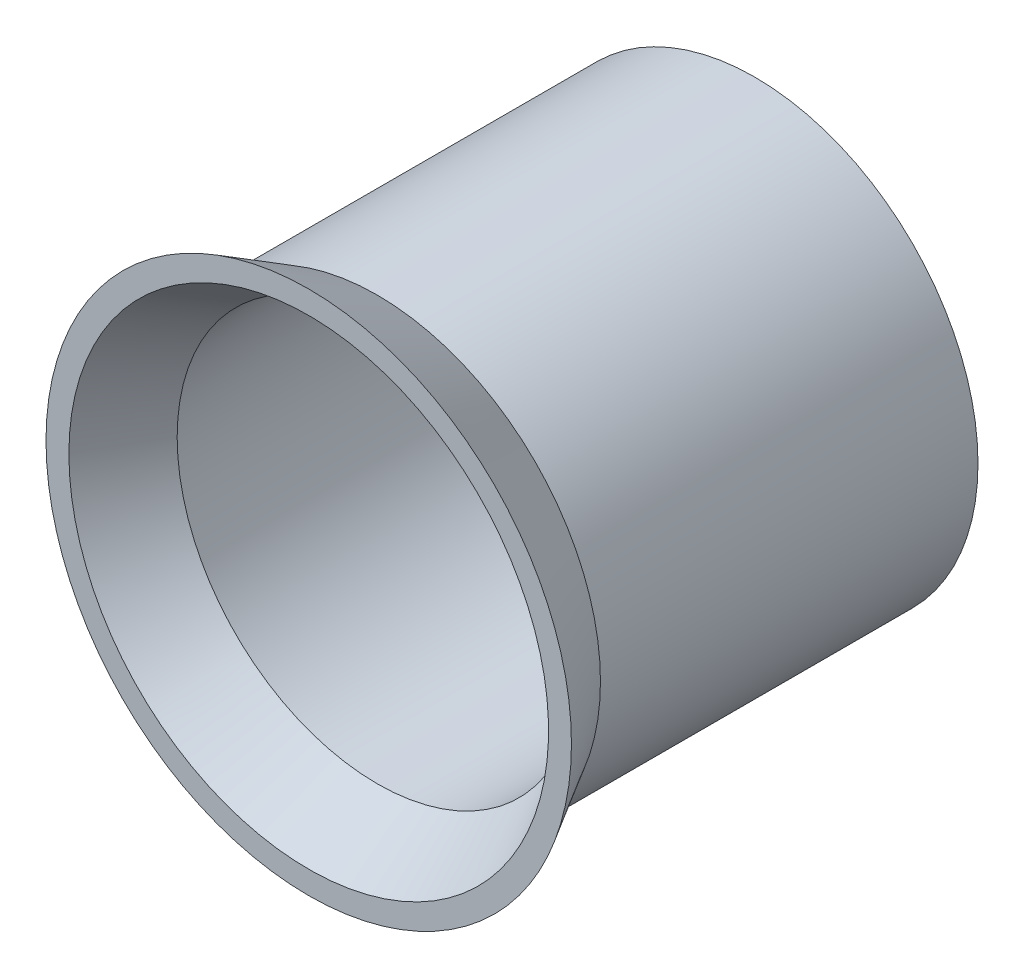
ISO-10303-21;
HEADER;
FILE_DESCRIPTION(('STEP AP214'),'2;1');
FILE_NAME('part.step','',(''),(''),'','','');
FILE_SCHEMA(('AUTOMOTIVE_DESIGN { 1 0 10303 214 1 1 1 1 }'));
ENDSEC;
DATA;
#1=APPLICATION_CONTEXT('core data for automotive mechanical design processes');
#2=APPLICATION_PROTOCOL_DEFINITION('international standard','automotive_design',2000,#1);
#3=PRODUCT_CONTEXT('',#1,'mechanical');
#4=PRODUCT('Part','Part','',(#3));
#5=PRODUCT_RELATED_PRODUCT_CATEGORY('part','',(#4));
#6=PRODUCT_DEFINITION_FORMATION('','',#4);
#7=PRODUCT_DEFINITION_CONTEXT('part definition',#1,'design');
#8=PRODUCT_DEFINITION('design','',#6,#7);
#9=PRODUCT_DEFINITION_SHAPE('','',#8);
#10=(LENGTH_UNIT() NAMED_UNIT(*) SI_UNIT(.MILLI.,.METRE.));
#11=(NAMED_UNIT(*) PLANE_ANGLE_UNIT() SI_UNIT($,.RADIAN.));
#12=(NAMED_UNIT(*) SI_UNIT($,.STERADIAN.) SOLID_ANGLE_UNIT());
#13=UNCERTAINTY_MEASURE_WITH_UNIT(LENGTH_MEASURE(1.E-05),#10,'distance_accuracy_value','');
#14=(GEOMETRIC_REPRESENTATION_CONTEXT(3) GLOBAL_UNCERTAINTY_ASSIGNED_CONTEXT((#13)) GLOBAL_UNIT_ASSIGNED_CONTEXT((#10,
#11,#12)) REPRESENTATION_CONTEXT('',''));
#15=CARTESIAN_POINT('',(0.,0.,0.));
#16=DIRECTION('',(0.,0.,1.));
#17=DIRECTION('',(1.,0.,0.));
#18=AXIS2_PLACEMENT_3D('',#15,#16,#17);
#19=CARTESIAN_POINT('',(0.,0.,37.));
#20=DIRECTION('',(0.,0.,-1.));
#21=DIRECTION('',(-1.,0.,0.));
#22=AXIS2_PLACEMENT_3D('',#19,#20,#21);
#23=CYLINDRICAL_SURFACE('',#22,17.5);
#24=CARTESIAN_POINT('',(0.,0.,4.));
#25=DIRECTION('',(0.,0.,1.));
#26=DIRECTION('',(1.,0.,0.));
#27=AXIS2_PLACEMENT_3D('',#24,#25,#26);
#28=CIRCLE('',#27,17.5);
#29=CARTESIAN_POINT('',(17.5,0.,4.));
#30=VERTEX_POINT('',#29);
#31=EDGE_CURVE('E10',#30,#30,#28,.T.);
#32=ORIENTED_EDGE('',*,*,#31,.F.);
#33=EDGE_LOOP('',(#32));
#34=FACE_BOUND('',#33,.T.);
#35=CARTESIAN_POINT('',(0.,0.,33.));
#36=DIRECTION('',(0.,0.,-1.));
#37=DIRECTION('',(-1.,0.,0.));
#38=AXIS2_PLACEMENT_3D('',#35,#36,#37);
#39=CIRCLE('',#38,17.5);
#40=CARTESIAN_POINT('',(-17.5,0.,33.));
#41=VERTEX_POINT('',#40);
#42=EDGE_CURVE('E73',#41,#41,#39,.T.);
#43=ORIENTED_EDGE('',*,*,#42,.F.);
#44=EDGE_LOOP('',(#43));
#45=FACE_BOUND('',#44,.T.);
#46=ADVANCED_FACE('F37',(#34,#45),#23,.F.);
#47=CARTESIAN_POINT('',(0.,0.,4.));
#48=DIRECTION('',(0.,0.,1.));
#49=DIRECTION('',(1.,0.,0.));
#50=AXIS2_PLACEMENT_3D('',#47,#48,#49);
#51=PLANE('',#50);
#52=ORIENTED_EDGE('',*,*,#31,.T.);
#53=EDGE_LOOP('',(#52));
#54=FACE_BOUND('',#53,.T.);
#55=CARTESIAN_POINT('',(0.,0.,4.));
#56=DIRECTION('',(0.,0.,1.));
#57=DIRECTION('',(1.,0.,0.));
#58=AXIS2_PLACEMENT_3D('',#55,#56,#57);
#59=CIRCLE('',#58,17.1);
#60=CARTESIAN_POINT('',(17.1,0.,4.));
#61=VERTEX_POINT('',#60);
#62=EDGE_CURVE('E55',#61,#61,#59,.T.);
#63=ORIENTED_EDGE('',*,*,#62,.F.);
#64=EDGE_LOOP('',(#63));
#65=FACE_BOUND('',#64,.T.);
#66=ADVANCED_FACE('F81',(#54,#65),#51,.T.);
#67=CARTESIAN_POINT('',(0.,0.,4.));
#68=DIRECTION('',(0.,0.,-1.));
#69=DIRECTION('',(-1.,0.,0.));
#70=AXIS2_PLACEMENT_3D('',#67,#68,#69);
#71=CYLINDRICAL_SURFACE('',#70,17.1);
#72=ORIENTED_EDGE('',*,*,#62,.T.);
#73=EDGE_LOOP('',(#72));
#74=FACE_BOUND('',#73,.T.);
#75=CARTESIAN_POINT('',(0.,0.,2.));
#76=DIRECTION('',(0.,0.,1.));
#77=DIRECTION('',(1.,0.,0.));
#78=AXIS2_PLACEMENT_3D('',#75,#76,#77);
#79=CIRCLE('',#78,17.1);
#80=CARTESIAN_POINT('',(17.1,0.,2.));
#81=VERTEX_POINT('',#80);
#82=EDGE_CURVE('E45',#81,#81,#79,.F.);
#83=ORIENTED_EDGE('',*,*,#82,.T.);
#84=EDGE_LOOP('',(#83));
#85=FACE_BOUND('',#84,.T.);
#86=ADVANCED_FACE('F87',(#74,#85),#71,.F.);
#87=CARTESIAN_POINT('',(0.,0.,2.));
#88=DIRECTION('',(0.,0.,1.));
#89=DIRECTION('',(1.,0.,0.));
#90=AXIS2_PLACEMENT_3D('',#87,#88,#89);
#91=PLANE('',#90);
#92=ORIENTED_EDGE('',*,*,#82,.F.);
#93=EDGE_LOOP('',(#92));
#94=FACE_BOUND('',#93,.T.);
#95=ADVANCED_FACE('F91',(#94),#91,.T.);
#96=CARTESIAN_POINT('',(0.,0.,39.));
#97=DIRECTION('',(0.,0.,1.));
#98=DIRECTION('',(1.,0.,0.));
#99=AXIS2_PLACEMENT_3D('',#96,#97,#98);
#100=CONICAL_SURFACE('',#99,22.9641016151378,0.523598775598304);
#101=CARTESIAN_POINT('',(0.,0.,33.));
#102=DIRECTION('',(0.,0.,1.));
#103=DIRECTION('',(1.,0.,0.));
#104=AXIS2_PLACEMENT_3D('',#101,#102,#103);
#105=CIRCLE('',#104,19.5);
#106=CARTESIAN_POINT('',(19.5,0.,33.));
#107=VERTEX_POINT('',#106);
#108=EDGE_CURVE('E61',#107,#107,#105,.T.);
#109=ORIENTED_EDGE('',*,*,#108,.T.);
#110=EDGE_LOOP('',(#109));
#111=FACE_BOUND('',#110,.T.);
#112=CARTESIAN_POINT('',(0.,0.,39.));
#113=DIRECTION('',(0.,0.,-1.));
#114=DIRECTION('',(-1.,0.,0.));
#115=AXIS2_PLACEMENT_3D('',#112,#113,#114);
#116=CIRCLE('',#115,22.9641016151378);
#117=CARTESIAN_POINT('',(-22.9641016151378,0.,39.));
#118=VERTEX_POINT('',#117);
#119=EDGE_CURVE('E65',#118,#118,#116,.T.);
#120=ORIENTED_EDGE('',*,*,#119,.T.);
#121=EDGE_LOOP('',(#120));
#122=FACE_BOUND('',#121,.T.);
#123=ADVANCED_FACE('F93',(#111,#122),#100,.T.);
#124=CARTESIAN_POINT('',(22.9641016151378,0.,39.));
#125=DIRECTION('',(0.,0.,-1.));
#126=DIRECTION('',(-1.,0.,0.));
#127=AXIS2_PLACEMENT_3D('',#124,#125,#126);
#128=PLANE('',#127);
#129=ORIENTED_EDGE('',*,*,#119,.F.);
#130=EDGE_LOOP('',(#129));
#131=FACE_BOUND('',#130,.T.);
#132=CARTESIAN_POINT('',(0.,0.,39.));
#133=DIRECTION('',(0.,0.,-1.));
#134=DIRECTION('',(-1.,0.,0.));
#135=AXIS2_PLACEMENT_3D('',#132,#133,#134);
#136=CIRCLE('',#135,20.9641016151378);
#137=CARTESIAN_POINT('',(-20.9641016151378,0.,39.));
#138=VERTEX_POINT('',#137);
#139=EDGE_CURVE('E69',#138,#138,#136,.T.);
#140=ORIENTED_EDGE('',*,*,#139,.T.);
#141=EDGE_LOOP('',(#140));
#142=FACE_BOUND('',#141,.T.);
#143=ADVANCED_FACE('F103',(#131,#142),#128,.F.);
#144=CARTESIAN_POINT('',(0.,0.,33.));
#145=DIRECTION('',(0.,0.,1.));
#146=DIRECTION('',(1.,0.,0.));
#147=AXIS2_PLACEMENT_3D('',#144,#145,#146);
#148=CONICAL_SURFACE('',#147,17.5,0.523598775598304);
#149=ORIENTED_EDGE('',*,*,#139,.F.);
#150=EDGE_LOOP('',(#149));
#151=FACE_BOUND('',#150,.T.);
#152=ORIENTED_EDGE('',*,*,#42,.T.);
#153=EDGE_LOOP('',(#152));
#154=FACE_BOUND('',#153,.T.);
#155=ADVANCED_FACE('F78',(#151,#154),#148,.F.);
#156=CARTESIAN_POINT('',(0.,0.,0.));
#157=DIRECTION('',(0.,0.,1.));
#158=DIRECTION('',(1.,0.,0.));
#159=AXIS2_PLACEMENT_3D('',#156,#157,#158);
#160=PLANE('',#159);
#161=CARTESIAN_POINT('',(0.,0.,0.));
#162=DIRECTION('',(0.,0.,1.));
#163=DIRECTION('',(1.,0.,0.));
#164=AXIS2_PLACEMENT_3D('',#161,#162,#163);
#165=CIRCLE('',#164,19.5);
#166=CARTESIAN_POINT('',(19.5,0.,0.));
#167=VERTEX_POINT('',#166);
#168=EDGE_CURVE('E50',#167,#167,#165,.T.);
#169=ORIENTED_EDGE('',*,*,#168,.F.);
#170=EDGE_LOOP('',(#169));
#171=FACE_BOUND('',#170,.T.);
#172=ADVANCED_FACE('F95',(#171),#160,.F.);
#173=CARTESIAN_POINT('',(0.,0.,37.));
#174=DIRECTION('',(0.,0.,-1.));
#175=DIRECTION('',(-1.,0.,0.));
#176=AXIS2_PLACEMENT_3D('',#173,#174,#175);
#177=CYLINDRICAL_SURFACE('',#176,19.5);
#178=ORIENTED_EDGE('',*,*,#168,.T.);
#179=EDGE_LOOP('',(#178));
#180=FACE_BOUND('',#179,.T.);
#181=ORIENTED_EDGE('',*,*,#108,.F.);
#182=EDGE_LOOP('',(#181));
#183=FACE_BOUND('',#182,.T.);
#184=ADVANCED_FACE('F39',(#180,#183),#177,.T.);
#185=CLOSED_SHELL('',(#46,#66,#86,#95,#123,#143,#155,#172,#184));
#186=MANIFOLD_SOLID_BREP('B2',#185);
#187=ADVANCED_BREP_SHAPE_REPRESENTATION('',(#18,#186),#14);
#188=SHAPE_DEFINITION_REPRESENTATION(#9,#187);
ENDSEC;
END-ISO-10303-21;
